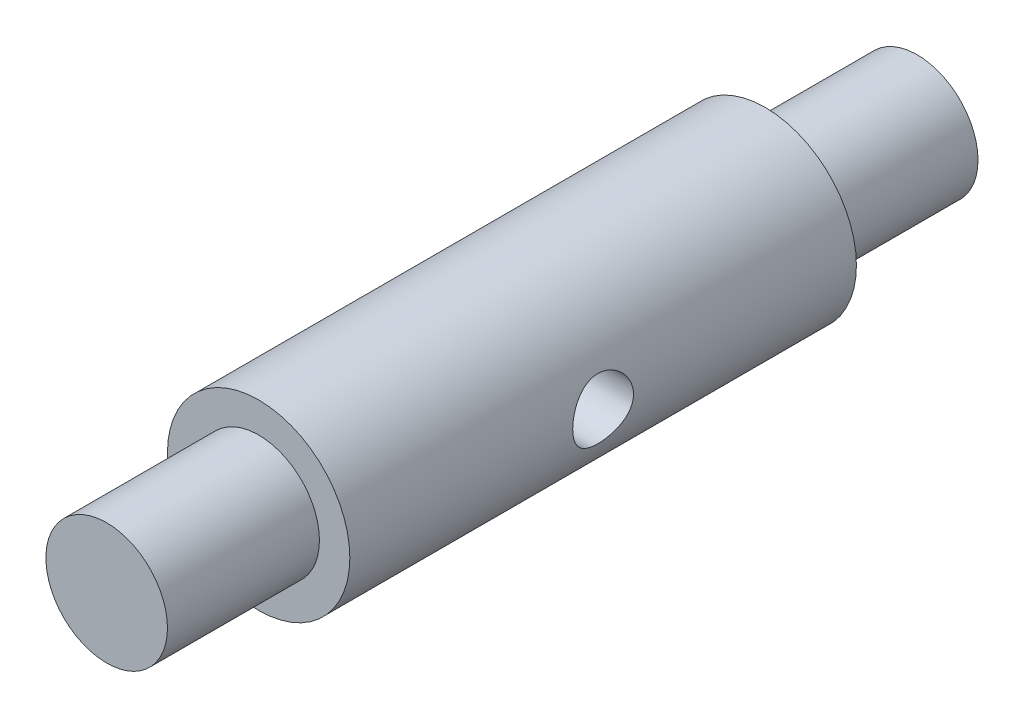
ISO-10303-21;
HEADER;
FILE_DESCRIPTION(('STEP AP214'),'2;1');
FILE_NAME('part.step','',(''),(''),'','','');
FILE_SCHEMA(('AUTOMOTIVE_DESIGN { 1 0 10303 214 1 1 1 1 }'));
ENDSEC;
DATA;
#1=APPLICATION_CONTEXT('core data for automotive mechanical design processes');
#2=APPLICATION_PROTOCOL_DEFINITION('international standard','automotive_design',2000,#1);
#3=PRODUCT_CONTEXT('',#1,'mechanical');
#4=PRODUCT('Part','Part','',(#3));
#5=PRODUCT_RELATED_PRODUCT_CATEGORY('part','',(#4));
#6=PRODUCT_DEFINITION_FORMATION('','',#4);
#7=PRODUCT_DEFINITION_CONTEXT('part definition',#1,'design');
#8=PRODUCT_DEFINITION('design','',#6,#7);
#9=PRODUCT_DEFINITION_SHAPE('','',#8);
#10=(LENGTH_UNIT() NAMED_UNIT(*) SI_UNIT(.MILLI.,.METRE.));
#11=(NAMED_UNIT(*) PLANE_ANGLE_UNIT() SI_UNIT($,.RADIAN.));
#12=(NAMED_UNIT(*) SI_UNIT($,.STERADIAN.) SOLID_ANGLE_UNIT());
#13=UNCERTAINTY_MEASURE_WITH_UNIT(LENGTH_MEASURE(1.E-05),#10,'distance_accuracy_value','');
#14=(GEOMETRIC_REPRESENTATION_CONTEXT(3) GLOBAL_UNCERTAINTY_ASSIGNED_CONTEXT((#13)) GLOBAL_UNIT_ASSIGNED_CONTEXT((#10,
#11,#12)) REPRESENTATION_CONTEXT('',''));
#15=CARTESIAN_POINT('',(0.,0.,0.));
#16=DIRECTION('',(0.,0.,1.));
#17=DIRECTION('',(1.,0.,0.));
#18=AXIS2_PLACEMENT_3D('',#15,#16,#17);
#19=CARTESIAN_POINT('',(0.,0.,25.));
#20=DIRECTION('',(0.,0.,-1.));
#21=DIRECTION('',(-1.,0.,0.));
#22=AXIS2_PLACEMENT_3D('',#19,#20,#21);
#23=CYLINDRICAL_SURFACE('',#22,9.);
#24=CARTESIAN_POINT('',(-9.,0.,-3.));
#25=CARTESIAN_POINT('',(-9.00000045902832,0.16369008866017,-3.00000076119492));
#26=CARTESIAN_POINT('',(-8.99549308522634,0.32737558361565,-2.98655920161835));
#27=CARTESIAN_POINT('',(-8.97795630609842,0.649925282618917,-2.93331267354834));
#28=CARTESIAN_POINT('',(-8.96492601606458,0.808788984356454,-2.89350496815323));
#29=CARTESIAN_POINT('',(-8.93175923719328,1.11699836850533,-2.78904226984785));
#30=CARTESIAN_POINT('',(-8.9116346319256,1.2663594776581,-2.72442881262218));
#31=CARTESIAN_POINT('',(-8.86633337152025,1.55212481041597,-2.57237648148496));
#32=CARTESIAN_POINT('',(-8.84115572003334,1.68852647087612,-2.4849331049922));
#33=CARTESIAN_POINT('',(-8.78742283329015,1.9492250250668,-2.28652258542374));
#34=CARTESIAN_POINT('',(-8.75878669391354,2.07301110089493,-2.17490629721852));
#35=CARTESIAN_POINT('',(-8.70180944349364,2.30049807810625,-1.9326985358803));
#36=CARTESIAN_POINT('',(-8.67346839871647,2.40419455646839,-1.80210289521446));
#37=CARTESIAN_POINT('',(-8.61939997431821,2.59147482668358,-1.52104465441062));
#38=CARTESIAN_POINT('',(-8.59377117827064,2.6743945746631,-1.37011878080363));
#39=CARTESIAN_POINT('',(-8.54925916255803,2.81345662163317,-1.05547171662436));
#40=CARTESIAN_POINT('',(-8.53037388482237,2.8696070921603,-0.891754448511769));
#41=CARTESIAN_POINT('',(-8.50233909808131,2.95162038452749,-0.561980335509869));
#42=CARTESIAN_POINT('',(-8.49288287308834,2.97844034481531,-0.396188374532807));
#43=CARTESIAN_POINT('',(-8.48386969888523,3.00402337000343,-0.0622087375323575));
#44=CARTESIAN_POINT('',(-8.4843096906819,3.00279510481416,0.105978182127571));
#45=CARTESIAN_POINT('',(-8.4947704502454,2.97305971111026,0.431809891332064));
#46=CARTESIAN_POINT('',(-8.50435247602599,2.94580173950098,0.589585208757057));
#47=CARTESIAN_POINT('',(-8.53129973173653,2.86681848854825,0.898180258820504));
#48=CARTESIAN_POINT('',(-8.54866589352323,2.81509027977561,1.04899915630521));
#49=CARTESIAN_POINT('',(-8.58953733393746,2.68781717418063,1.34223824877444));
#50=CARTESIAN_POINT('',(-8.61313697379352,2.61190214612179,1.48448407640858));
#51=CARTESIAN_POINT('',(-8.66377675727179,2.43866731890942,1.75461272483918));
#52=CARTESIAN_POINT('',(-8.69081789371391,2.34134133709202,1.88249138080014));
#53=CARTESIAN_POINT('',(-8.74701987503223,2.12204799804671,2.12727479448232));
#54=CARTESIAN_POINT('',(-8.77621768064528,1.99905945022893,2.24325808352721));
#55=CARTESIAN_POINT('',(-8.8322081516111,1.73501870991019,2.45319379999019));
#56=CARTESIAN_POINT('',(-8.85900058614202,1.59396478698244,2.54714411449349));
#57=CARTESIAN_POINT('',(-8.90751323813381,1.2958428391388,2.71108890070521));
#58=CARTESIAN_POINT('',(-8.92918050024118,1.13862982924901,2.7808364740222));
#59=CARTESIAN_POINT('',(-8.96461701433304,0.813807250093523,2.89260952186713));
#60=CARTESIAN_POINT('',(-8.97838900964638,0.646201314464861,2.93464462627031));
#61=CARTESIAN_POINT('',(-8.99602881214321,0.313151488587913,2.98816699806708));
#62=CARTESIAN_POINT('',(-9.00030005501184,0.147928799594539,3.00089942751825));
#63=CARTESIAN_POINT('',(-8.99966708084482,-0.182325209880712,2.99900197920459));
#64=CARTESIAN_POINT('',(-8.99476441258087,-0.347356557958951,2.98437672006037));
#65=CARTESIAN_POINT('',(-8.97660074151313,-0.667559598912766,2.92916427679212));
#66=CARTESIAN_POINT('',(-8.96358596133577,-0.822878420504529,2.88934138185152));
#67=CARTESIAN_POINT('',(-8.9307554049021,-1.12456787573872,2.78581966659982));
#68=CARTESIAN_POINT('',(-8.91093876140025,-1.27093736552582,2.72211780159664));
#69=CARTESIAN_POINT('',(-8.86586793861869,-1.55486488917982,2.57078870447764));
#70=CARTESIAN_POINT('',(-8.84048444267358,-1.69208987765144,2.48257622015049));
#71=CARTESIAN_POINT('',(-8.78715761748787,-1.95019449040676,2.28541754995955));
#72=CARTESIAN_POINT('',(-8.75921350781483,-2.07106910338673,2.17646503190471));
#73=CARTESIAN_POINT('',(-8.70230543941334,-2.2987575234189,1.93506374698024));
#74=CARTESIAN_POINT('',(-8.67335283262284,-2.40468290773731,1.80177231921942));
#75=CARTESIAN_POINT('',(-8.61899919884126,-2.59277256697072,1.51868529656734));
#76=CARTESIAN_POINT('',(-8.59359820146007,-2.67493664379304,1.36888956409777));
#77=CARTESIAN_POINT('',(-8.54947175374151,-2.81279079124908,1.05698095413031));
#78=CARTESIAN_POINT('',(-8.53073282378936,-2.86853439649506,0.894893762493703));
#79=CARTESIAN_POINT('',(-8.50232496919349,-2.95168400027807,0.562864049867609));
#80=CARTESIAN_POINT('',(-8.49265195870918,-2.97910276486182,0.392925103786952));
#81=CARTESIAN_POINT('',(-8.48393576622531,-3.00382884743203,0.0594087118772512));
#82=CARTESIAN_POINT('',(-8.48437200772245,-3.0026107719252,-0.10404702086047));
#83=CARTESIAN_POINT('',(-8.49453809471602,-2.97372688034608,-0.428295224766187));
#84=CARTESIAN_POINT('',(-8.50426738708085,-2.94606263837576,-0.589087853865265));
#85=CARTESIAN_POINT('',(-8.53153572914675,-2.86611543938804,-0.900406989007417));
#86=CARTESIAN_POINT('',(-8.54892294067433,-2.81431003804654,-1.05107047501349));
#87=CARTESIAN_POINT('',(-8.58949196455405,-2.68793809727924,-1.34168222081481));
#88=CARTESIAN_POINT('',(-8.61267506290179,-2.61336650566142,-1.48162809356402));
#89=CARTESIAN_POINT('',(-8.66348487678139,-2.43978207775029,-1.75345100976873));
#90=CARTESIAN_POINT('',(-8.69126134926411,-2.33984472829374,-1.88470950569516));
#91=CARTESIAN_POINT('',(-8.74750068849758,-2.11992864940695,-2.1290694401526));
#92=CARTESIAN_POINT('',(-8.77596374737117,-1.99994425335445,-2.24216572706422));
#93=CARTESIAN_POINT('',(-8.83170091576632,-1.73772467076207,-2.45143323686754));
#94=CARTESIAN_POINT('',(-8.8588854540377,-1.59480454049919,-2.546773043253));
#95=CARTESIAN_POINT('',(-8.90777973517836,-1.29407207221987,-2.71197128655194));
#96=CARTESIAN_POINT('',(-8.9294908772379,-1.13626355439705,-2.78183623776613));
#97=CARTESIAN_POINT('',(-8.96416545205626,-0.817480941602928,-2.89116489746602));
#98=CARTESIAN_POINT('',(-8.97747637267568,-0.656963273029225,-2.93184739879013));
#99=CARTESIAN_POINT('',(-8.99539221192665,-0.33096124803074,-2.98626084203138));
#100=CARTESIAN_POINT('',(-8.99999953595715,-0.165478276706239,-2.99999923048961));
#101=CARTESIAN_POINT('',(-9.,0.,-3.));
#102=B_SPLINE_CURVE_WITH_KNOTS('',3,(#24,#25,#26,#27,#28,#29,#30,#31,#32,#33,#34,#35,#36,#37,
#38,#39,#40,#41,#42,#43,#44,#45,#46,#47,#48,#49,#50,#51,#52,#53,#54,#55,#56,#57,#58,#59,#60,#61,
#62,#63,#64,#65,#66,#67,#68,#69,#70,#71,#72,#73,#74,#75,#76,#77,#78,#79,#80,#81,#82,#83,#84,#85,
#86,#87,#88,#89,#90,#91,#92,#93,#94,#95,#96,#97,#98,#99,#100,#101),.UNSPECIFIED.,.T.,.F.,(4,2,2,
2,2,2,2,2,2,2,2,2,2,2,2,2,2,2,2,2,2,2,2,2,2,2,2,2,2,2,2,2,2,2,2,2,2,2,4),(0.,0.490461318078033,
0.980973555802563,1.47066801861082,1.9604591333973,2.46554052848268,2.97073299862591,
3.49045154470411,4.010011340785,4.5120577722552,5.01394901962456,5.49290479653841,
5.97191792566446,6.45864513465392,6.94551307674622,7.45779917434101,7.97013437899855,
8.48755216951073,9.00479006631625,9.49960749525509,9.9943413949253,10.4747447393464,
10.9552093585231,11.4483119953121,11.9415654246567,12.4572306864226,12.9729002470499,
13.4875204148031,14.0019085411752,14.4898699819278,14.9778023805413,15.4564676124125,
15.9352391452793,16.4349020007541,16.9347063337134,17.453989825053,17.9731404345737,
18.4690967512144,18.9649159811442),.UNSPECIFIED.);
#103=CARTESIAN_POINT('',(-9.,0.,-3.));
#104=VERTEX_POINT('',#103);
#105=EDGE_CURVE('E10',#104,#104,#102,.T.);
#106=ORIENTED_EDGE('',*,*,#105,.T.);
#107=EDGE_LOOP('',(#106));
#108=FACE_BOUND('',#107,.T.);
#109=CARTESIAN_POINT('',(9.,0.,-3.));
#110=CARTESIAN_POINT('',(9.00000045902832,-0.16369008866017,-3.00000076119492));
#111=CARTESIAN_POINT('',(8.99549308522634,-0.32737558361565,-2.98655920161835));
#112=CARTESIAN_POINT('',(8.97795630609842,-0.649925282618917,-2.93331267354834));
#113=CARTESIAN_POINT('',(8.96492601606458,-0.808788984356454,-2.89350496815323));
#114=CARTESIAN_POINT('',(8.93175923719328,-1.11699836850533,-2.78904226984785));
#115=CARTESIAN_POINT('',(8.9116346319256,-1.2663594776581,-2.72442881262218));
#116=CARTESIAN_POINT('',(8.86633337152025,-1.55212481041597,-2.57237648148496));
#117=CARTESIAN_POINT('',(8.84115572003334,-1.68852647087612,-2.4849331049922));
#118=CARTESIAN_POINT('',(8.78742283329015,-1.9492250250668,-2.28652258542374));
#119=CARTESIAN_POINT('',(8.75878669391354,-2.07301110089493,-2.17490629721852));
#120=CARTESIAN_POINT('',(8.70180944349364,-2.30049807810625,-1.9326985358803));
#121=CARTESIAN_POINT('',(8.67346839871647,-2.40419455646839,-1.80210289521446));
#122=CARTESIAN_POINT('',(8.61939997431821,-2.59147482668358,-1.52104465441062));
#123=CARTESIAN_POINT('',(8.59377117827064,-2.6743945746631,-1.37011878080363));
#124=CARTESIAN_POINT('',(8.54925916255803,-2.81345662163317,-1.05547171662436));
#125=CARTESIAN_POINT('',(8.53037388482237,-2.8696070921603,-0.891754448511769));
#126=CARTESIAN_POINT('',(8.50233909808131,-2.95162038452749,-0.561980335509869));
#127=CARTESIAN_POINT('',(8.49288287308834,-2.97844034481531,-0.396188374532807));
#128=CARTESIAN_POINT('',(8.48386969888523,-3.00402337000343,-0.0622087375323575));
#129=CARTESIAN_POINT('',(8.4843096906819,-3.00279510481416,0.105978182127571));
#130=CARTESIAN_POINT('',(8.4947704502454,-2.97305971111026,0.431809891332064));
#131=CARTESIAN_POINT('',(8.50435247602599,-2.94580173950098,0.589585208757057));
#132=CARTESIAN_POINT('',(8.53129973173653,-2.86681848854825,0.898180258820504));
#133=CARTESIAN_POINT('',(8.54866589352323,-2.81509027977561,1.04899915630521));
#134=CARTESIAN_POINT('',(8.58953733393746,-2.68781717418063,1.34223824877444));
#135=CARTESIAN_POINT('',(8.61313697379352,-2.61190214612179,1.48448407640858));
#136=CARTESIAN_POINT('',(8.66377675727179,-2.43866731890942,1.75461272483918));
#137=CARTESIAN_POINT('',(8.69081789371391,-2.34134133709202,1.88249138080014));
#138=CARTESIAN_POINT('',(8.74701987503223,-2.12204799804671,2.12727479448232));
#139=CARTESIAN_POINT('',(8.77621768064528,-1.99905945022893,2.24325808352721));
#140=CARTESIAN_POINT('',(8.8322081516111,-1.73501870991019,2.45319379999019));
#141=CARTESIAN_POINT('',(8.85900058614202,-1.59396478698244,2.54714411449349));
#142=CARTESIAN_POINT('',(8.90751323813381,-1.2958428391388,2.71108890070521));
#143=CARTESIAN_POINT('',(8.92918050024118,-1.13862982924901,2.7808364740222));
#144=CARTESIAN_POINT('',(8.96461701433304,-0.813807250093523,2.89260952186713));
#145=CARTESIAN_POINT('',(8.97838900964638,-0.646201314464861,2.93464462627031));
#146=CARTESIAN_POINT('',(8.99602881214321,-0.313151488587913,2.98816699806708));
#147=CARTESIAN_POINT('',(9.00030005501184,-0.147928799594539,3.00089942751825));
#148=CARTESIAN_POINT('',(8.99966708084482,0.182325209880712,2.99900197920459));
#149=CARTESIAN_POINT('',(8.99476441258087,0.347356557958951,2.98437672006037));
#150=CARTESIAN_POINT('',(8.97660074151313,0.667559598912766,2.92916427679212));
#151=CARTESIAN_POINT('',(8.96358596133577,0.822878420504529,2.88934138185152));
#152=CARTESIAN_POINT('',(8.9307554049021,1.12456787573872,2.78581966659982));
#153=CARTESIAN_POINT('',(8.91093876140025,1.27093736552582,2.72211780159664));
#154=CARTESIAN_POINT('',(8.86586793861869,1.55486488917982,2.57078870447764));
#155=CARTESIAN_POINT('',(8.84048444267358,1.69208987765144,2.48257622015049));
#156=CARTESIAN_POINT('',(8.78715761748787,1.95019449040676,2.28541754995955));
#157=CARTESIAN_POINT('',(8.75921350781483,2.07106910338673,2.17646503190471));
#158=CARTESIAN_POINT('',(8.70230543941334,2.2987575234189,1.93506374698024));
#159=CARTESIAN_POINT('',(8.67335283262284,2.40468290773731,1.80177231921942));
#160=CARTESIAN_POINT('',(8.61899919884126,2.59277256697072,1.51868529656734));
#161=CARTESIAN_POINT('',(8.59359820146007,2.67493664379304,1.36888956409777));
#162=CARTESIAN_POINT('',(8.54947175374151,2.81279079124908,1.05698095413031));
#163=CARTESIAN_POINT('',(8.53073282378936,2.86853439649506,0.894893762493703));
#164=CARTESIAN_POINT('',(8.50232496919349,2.95168400027807,0.562864049867609));
#165=CARTESIAN_POINT('',(8.49265195870918,2.97910276486182,0.392925103786952));
#166=CARTESIAN_POINT('',(8.48393576622531,3.00382884743203,0.0594087118772512));
#167=CARTESIAN_POINT('',(8.48437200772245,3.0026107719252,-0.10404702086047));
#168=CARTESIAN_POINT('',(8.49453809471602,2.97372688034608,-0.428295224766187));
#169=CARTESIAN_POINT('',(8.50426738708085,2.94606263837576,-0.589087853865265));
#170=CARTESIAN_POINT('',(8.53153572914675,2.86611543938804,-0.900406989007417));
#171=CARTESIAN_POINT('',(8.54892294067433,2.81431003804654,-1.05107047501349));
#172=CARTESIAN_POINT('',(8.58949196455405,2.68793809727924,-1.34168222081481));
#173=CARTESIAN_POINT('',(8.61267506290179,2.61336650566142,-1.48162809356402));
#174=CARTESIAN_POINT('',(8.66348487678139,2.43978207775029,-1.75345100976873));
#175=CARTESIAN_POINT('',(8.69126134926411,2.33984472829374,-1.88470950569516));
#176=CARTESIAN_POINT('',(8.74750068849758,2.11992864940695,-2.1290694401526));
#177=CARTESIAN_POINT('',(8.77596374737117,1.99994425335445,-2.24216572706422));
#178=CARTESIAN_POINT('',(8.83170091576632,1.73772467076207,-2.45143323686754));
#179=CARTESIAN_POINT('',(8.8588854540377,1.59480454049919,-2.546773043253));
#180=CARTESIAN_POINT('',(8.90777973517836,1.29407207221987,-2.71197128655194));
#181=CARTESIAN_POINT('',(8.9294908772379,1.13626355439705,-2.78183623776613));
#182=CARTESIAN_POINT('',(8.96416545205626,0.817480941602928,-2.89116489746602));
#183=CARTESIAN_POINT('',(8.97747637267568,0.656963273029225,-2.93184739879013));
#184=CARTESIAN_POINT('',(8.99539221192665,0.33096124803074,-2.98626084203138));
#185=CARTESIAN_POINT('',(8.99999953595715,0.165478276706239,-2.99999923048961));
#186=CARTESIAN_POINT('',(9.,0.,-3.));
#187=B_SPLINE_CURVE_WITH_KNOTS('',3,(#109,#110,#111,#112,#113,#114,#115,#116,#117,#118,#119,
#120,#121,#122,#123,#124,#125,#126,#127,#128,#129,#130,#131,#132,#133,#134,#135,#136,#137,#138,
#139,#140,#141,#142,#143,#144,#145,#146,#147,#148,#149,#150,#151,#152,#153,#154,#155,#156,#157,
#158,#159,#160,#161,#162,#163,#164,#165,#166,#167,#168,#169,#170,#171,#172,#173,#174,#175,#176,
#177,#178,#179,#180,#181,#182,#183,#184,#185,#186),.UNSPECIFIED.,.T.,.F.,(4,2,2,2,2,2,2,2,2,2,2,
2,2,2,2,2,2,2,2,2,2,2,2,2,2,2,2,2,2,2,2,2,2,2,2,2,2,2,4),(0.,0.490461318078033,
0.980973555802563,1.47066801861082,1.9604591333973,2.46554052848268,2.97073299862591,
3.49045154470411,4.010011340785,4.5120577722552,5.01394901962456,5.49290479653841,
5.97191792566446,6.45864513465392,6.94551307674622,7.45779917434101,7.97013437899855,
8.48755216951073,9.00479006631625,9.49960749525509,9.9943413949253,10.4747447393464,
10.9552093585231,11.4483119953121,11.9415654246567,12.4572306864226,12.9729002470499,
13.4875204148031,14.0019085411752,14.4898699819278,14.9778023805413,15.4564676124125,
15.9352391452793,16.4349020007541,16.9347063337134,17.453989825053,17.9731404345737,
18.4690967512144,18.9649159811442),.UNSPECIFIED.);
#188=CARTESIAN_POINT('',(9.,0.,-3.));
#189=VERTEX_POINT('',#188);
#190=EDGE_CURVE('E54',#189,#189,#187,.T.);
#191=ORIENTED_EDGE('',*,*,#190,.T.);
#192=EDGE_LOOP('',(#191));
#193=FACE_BOUND('',#192,.T.);
#194=CARTESIAN_POINT('',(0.,0.,25.));
#195=DIRECTION('',(0.,0.,1.));
#196=DIRECTION('',(1.,0.,0.));
#197=AXIS2_PLACEMENT_3D('',#194,#195,#196);
#198=CIRCLE('',#197,9.);
#199=CARTESIAN_POINT('',(9.,0.,25.));
#200=VERTEX_POINT('',#199);
#201=EDGE_CURVE('E66',#200,#200,#198,.T.);
#202=ORIENTED_EDGE('',*,*,#201,.F.);
#203=EDGE_LOOP('',(#202));
#204=FACE_BOUND('',#203,.T.);
#205=CARTESIAN_POINT('',(0.,0.,-25.));
#206=DIRECTION('',(0.,0.,1.));
#207=DIRECTION('',(1.,0.,0.));
#208=AXIS2_PLACEMENT_3D('',#205,#206,#207);
#209=CIRCLE('',#208,9.);
#210=CARTESIAN_POINT('',(9.,0.,-25.));
#211=VERTEX_POINT('',#210);
#212=EDGE_CURVE('E110',#211,#211,#209,.T.);
#213=ORIENTED_EDGE('',*,*,#212,.T.);
#214=EDGE_LOOP('',(#213));
#215=FACE_BOUND('',#214,.T.);
#216=ADVANCED_FACE('F42',(#108,#193,#204,#215),#23,.T.);
#217=CARTESIAN_POINT('',(0.,0.,25.));
#218=DIRECTION('',(0.,0.,1.));
#219=DIRECTION('',(1.,0.,0.));
#220=AXIS2_PLACEMENT_3D('',#217,#218,#219);
#221=PLANE('',#220);
#222=CARTESIAN_POINT('',(0.,0.,25.));
#223=DIRECTION('',(0.,0.,1.));
#224=DIRECTION('',(1.,0.,0.));
#225=AXIS2_PLACEMENT_3D('',#222,#223,#224);
#226=CIRCLE('',#225,6.);
#227=CARTESIAN_POINT('',(6.,0.,25.));
#228=VERTEX_POINT('',#227);
#229=EDGE_CURVE('E112',#228,#228,#226,.F.);
#230=ORIENTED_EDGE('',*,*,#229,.T.);
#231=EDGE_LOOP('',(#230));
#232=FACE_BOUND('',#231,.T.);
#233=ORIENTED_EDGE('',*,*,#201,.T.);
#234=EDGE_LOOP('',(#233));
#235=FACE_BOUND('',#234,.T.);
#236=ADVANCED_FACE('F92',(#232,#235),#221,.T.);
#237=CARTESIAN_POINT('',(0.,0.,-25.));
#238=DIRECTION('',(0.,0.,1.));
#239=DIRECTION('',(1.,0.,0.));
#240=AXIS2_PLACEMENT_3D('',#237,#238,#239);
#241=PLANE('',#240);
#242=CARTESIAN_POINT('',(0.,0.,-25.));
#243=DIRECTION('',(0.,0.,1.));
#244=DIRECTION('',(1.,0.,0.));
#245=AXIS2_PLACEMENT_3D('',#242,#243,#244);
#246=CIRCLE('',#245,6.);
#247=CARTESIAN_POINT('',(6.,0.,-25.));
#248=VERTEX_POINT('',#247);
#249=EDGE_CURVE('E60',#248,#248,#246,.F.);
#250=ORIENTED_EDGE('',*,*,#249,.F.);
#251=EDGE_LOOP('',(#250));
#252=FACE_BOUND('',#251,.T.);
#253=ORIENTED_EDGE('',*,*,#212,.F.);
#254=EDGE_LOOP('',(#253));
#255=FACE_BOUND('',#254,.T.);
#256=ADVANCED_FACE('F87',(#252,#255),#241,.F.);
#257=CARTESIAN_POINT('',(0.,0.,-40.));
#258=DIRECTION('',(0.,0.,1.));
#259=DIRECTION('',(1.,0.,0.));
#260=AXIS2_PLACEMENT_3D('',#257,#258,#259);
#261=PLANE('',#260);
#262=CARTESIAN_POINT('',(0.,0.,-40.));
#263=DIRECTION('',(0.,0.,1.));
#264=DIRECTION('',(1.,0.,0.));
#265=AXIS2_PLACEMENT_3D('',#262,#263,#264);
#266=CIRCLE('',#265,6.);
#267=CARTESIAN_POINT('',(6.,0.,-40.));
#268=VERTEX_POINT('',#267);
#269=EDGE_CURVE('E120',#268,#268,#266,.T.);
#270=ORIENTED_EDGE('',*,*,#269,.F.);
#271=EDGE_LOOP('',(#270));
#272=FACE_BOUND('',#271,.T.);
#273=ADVANCED_FACE('F83',(#272),#261,.F.);
#274=CARTESIAN_POINT('',(0.,0.,40.));
#275=DIRECTION('',(0.,0.,-1.));
#276=DIRECTION('',(-1.,0.,0.));
#277=AXIS2_PLACEMENT_3D('',#274,#275,#276);
#278=CYLINDRICAL_SURFACE('',#277,6.);
#279=ORIENTED_EDGE('',*,*,#269,.T.);
#280=EDGE_LOOP('',(#279));
#281=FACE_BOUND('',#280,.T.);
#282=ORIENTED_EDGE('',*,*,#249,.T.);
#283=EDGE_LOOP('',(#282));
#284=FACE_BOUND('',#283,.T.);
#285=ADVANCED_FACE('F86',(#281,#284),#278,.T.);
#286=ORIENTED_EDGE('',*,*,#229,.F.);
#287=EDGE_LOOP('',(#286));
#288=FACE_BOUND('',#287,.T.);
#289=CARTESIAN_POINT('',(0.,0.,40.));
#290=DIRECTION('',(0.,0.,1.));
#291=DIRECTION('',(1.,0.,0.));
#292=AXIS2_PLACEMENT_3D('',#289,#290,#291);
#293=CIRCLE('',#292,6.);
#294=CARTESIAN_POINT('',(6.,0.,40.));
#295=VERTEX_POINT('',#294);
#296=EDGE_CURVE('E117',#295,#295,#293,.T.);
#297=ORIENTED_EDGE('',*,*,#296,.F.);
#298=EDGE_LOOP('',(#297));
#299=FACE_BOUND('',#298,.T.);
#300=ADVANCED_FACE('F81',(#288,#299),#278,.T.);
#301=CARTESIAN_POINT('',(0.,0.,40.));
#302=DIRECTION('',(0.,0.,1.));
#303=DIRECTION('',(1.,0.,0.));
#304=AXIS2_PLACEMENT_3D('',#301,#302,#303);
#305=PLANE('',#304);
#306=ORIENTED_EDGE('',*,*,#296,.T.);
#307=EDGE_LOOP('',(#306));
#308=FACE_BOUND('',#307,.T.);
#309=ADVANCED_FACE('F76',(#308),#305,.T.);
#310=CARTESIAN_POINT('',(-9.,0.,0.));
#311=DIRECTION('',(1.,0.,0.));
#312=DIRECTION('',(0.,0.,-1.));
#313=AXIS2_PLACEMENT_3D('',#310,#311,#312);
#314=CYLINDRICAL_SURFACE('',#313,3.);
#315=ORIENTED_EDGE('',*,*,#190,.F.);
#316=EDGE_LOOP('',(#315));
#317=FACE_BOUND('',#316,.T.);
#318=ORIENTED_EDGE('',*,*,#105,.F.);
#319=EDGE_LOOP('',(#318));
#320=FACE_BOUND('',#319,.T.);
#321=ADVANCED_FACE('F72',(#317,#320),#314,.F.);
#322=CLOSED_SHELL('',(#216,#236,#256,#273,#285,#300,#309,#321));
#323=MANIFOLD_SOLID_BREP('B2',#322);
#324=ADVANCED_BREP_SHAPE_REPRESENTATION('',(#18,#323),#14);
#325=SHAPE_DEFINITION_REPRESENTATION(#9,#324);
ENDSEC;
END-ISO-10303-21;
